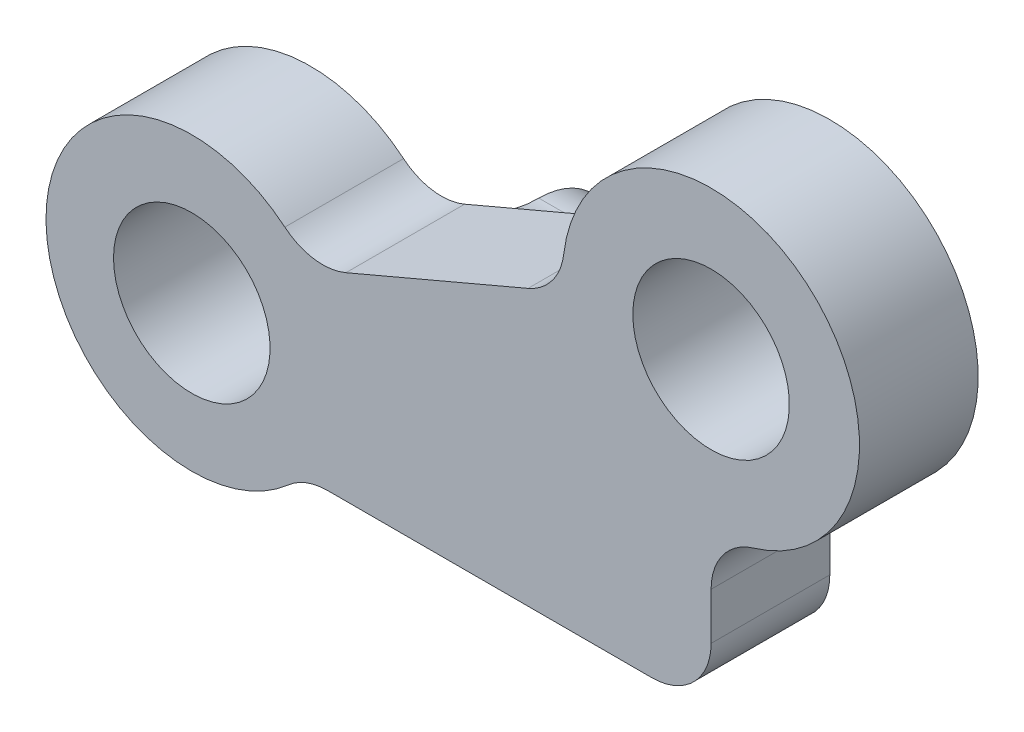
ISO-10303-21;
HEADER;
FILE_DESCRIPTION(('STEP AP214'),'2;1');
FILE_NAME('part.step','',(''),(''),'','','');
FILE_SCHEMA(('AUTOMOTIVE_DESIGN { 1 0 10303 214 1 1 1 1 }'));
ENDSEC;
DATA;
#1=APPLICATION_CONTEXT('core data for automotive mechanical design processes');
#2=APPLICATION_PROTOCOL_DEFINITION('international standard','automotive_design',2000,#1);
#3=PRODUCT_CONTEXT('',#1,'mechanical');
#4=PRODUCT('Part','Part','',(#3));
#5=PRODUCT_RELATED_PRODUCT_CATEGORY('part','',(#4));
#6=PRODUCT_DEFINITION_FORMATION('','',#4);
#7=PRODUCT_DEFINITION_CONTEXT('part definition',#1,'design');
#8=PRODUCT_DEFINITION('design','',#6,#7);
#9=PRODUCT_DEFINITION_SHAPE('','',#8);
#10=(LENGTH_UNIT() NAMED_UNIT(*) SI_UNIT(.MILLI.,.METRE.));
#11=(NAMED_UNIT(*) PLANE_ANGLE_UNIT() SI_UNIT($,.RADIAN.));
#12=(NAMED_UNIT(*) SI_UNIT($,.STERADIAN.) SOLID_ANGLE_UNIT());
#13=UNCERTAINTY_MEASURE_WITH_UNIT(LENGTH_MEASURE(1.E-05),#10,'distance_accuracy_value','');
#14=(GEOMETRIC_REPRESENTATION_CONTEXT(3) GLOBAL_UNCERTAINTY_ASSIGNED_CONTEXT((#13)) GLOBAL_UNIT_ASSIGNED_CONTEXT((#10,
#11,#12)) REPRESENTATION_CONTEXT('',''));
#15=CARTESIAN_POINT('',(0.,0.,0.));
#16=DIRECTION('',(0.,0.,1.));
#17=DIRECTION('',(1.,0.,0.));
#18=AXIS2_PLACEMENT_3D('',#15,#16,#17);
#19=CARTESIAN_POINT('',(39.3405929872107,26.4759472363339,4.));
#20=DIRECTION('',(0.,0.,-1.));
#21=DIRECTION('',(-1.,0.,0.));
#22=AXIS2_PLACEMENT_3D('',#19,#20,#21);
#23=CYLINDRICAL_SURFACE('',#22,4.91303849973908);
#24=CARTESIAN_POINT('',(39.3405929872107,26.4759472363339,0.));
#25=DIRECTION('',(0.,0.,-1.));
#26=DIRECTION('',(-1.,0.,0.));
#27=AXIS2_PLACEMENT_3D('',#24,#25,#26);
#28=CIRCLE('',#27,4.91303849973908);
#29=CARTESIAN_POINT('',(42.5911839602965,22.7919812178138,0.));
#30=VERTEX_POINT('',#29);
#31=CARTESIAN_POINT('',(42.4759512366879,30.2584696681713,0.));
#32=VERTEX_POINT('',#31);
#33=EDGE_CURVE('E199',#30,#32,#28,.T.);
#34=ORIENTED_EDGE('',*,*,#33,.F.);
#35=DIRECTION('',(0.,0.,-1.));
#36=VECTOR('',#35,1.);
#37=CARTESIAN_POINT('',(42.5911839602965,22.7919812178138,4.));
#38=LINE('',#37,#36);
#39=CARTESIAN_POINT('',(42.5911839602965,22.7919812178138,4.));
#40=VERTEX_POINT('',#39);
#41=EDGE_CURVE('E248',#30,#40,#38,.F.);
#42=ORIENTED_EDGE('',*,*,#41,.T.);
#43=CARTESIAN_POINT('',(39.3405929872107,26.4759472363339,4.));
#44=DIRECTION('',(0.,0.,-1.));
#45=DIRECTION('',(-1.,0.,0.));
#46=AXIS2_PLACEMENT_3D('',#43,#44,#45);
#47=CIRCLE('',#46,4.91303849973908);
#48=CARTESIAN_POINT('',(42.4759512366879,30.2584696681713,4.));
#49=VERTEX_POINT('',#48);
#50=EDGE_CURVE('E200',#40,#49,#47,.T.);
#51=ORIENTED_EDGE('',*,*,#50,.T.);
#52=DIRECTION('',(0.,0.,-1.));
#53=VECTOR('',#52,1.);
#54=CARTESIAN_POINT('',(42.4759512366879,30.2584696681713,4.));
#55=LINE('',#54,#53);
#56=EDGE_CURVE('E245',#49,#32,#55,.T.);
#57=ORIENTED_EDGE('',*,*,#56,.T.);
#58=EDGE_LOOP('',(#34,#42,#51,#57));
#59=FACE_BOUND('',#58,.T.);
#60=ADVANCED_FACE('F33',(#59),#23,.T.);
#61=CARTESIAN_POINT('',(56.8390710383438,23.2923121153975,4.));
#62=DIRECTION('',(0.,-1.,0.));
#63=DIRECTION('',(0.,0.,-1.));
#64=AXIS2_PLACEMENT_3D('',#61,#62,#63);
#65=PLANE('',#64);
#66=DIRECTION('',(-1.,0.,0.));
#67=VECTOR('',#66,1.);
#68=CARTESIAN_POINT('',(56.8390710383438,23.2923121153975,4.));
#69=LINE('',#68,#67);
#70=CARTESIAN_POINT('',(54.8390710383438,23.2923121153975,4.));
#71=VERTEX_POINT('',#70);
#72=CARTESIAN_POINT('',(43.9144347238549,23.2923121153975,4.));
#73=VERTEX_POINT('',#72);
#74=EDGE_CURVE('E213',#71,#73,#69,.T.);
#75=ORIENTED_EDGE('',*,*,#74,.T.);
#76=DIRECTION('',(0.,0.,1.));
#77=VECTOR('',#76,1.);
#78=CARTESIAN_POINT('',(43.9144347238549,23.2923121153975,0.));
#79=LINE('',#78,#77);
#80=CARTESIAN_POINT('',(43.9144347238549,23.2923121153975,0.));
#81=VERTEX_POINT('',#80);
#82=EDGE_CURVE('E242',#73,#81,#79,.F.);
#83=ORIENTED_EDGE('',*,*,#82,.T.);
#84=DIRECTION('',(-1.,0.,0.));
#85=VECTOR('',#84,1.);
#86=CARTESIAN_POINT('',(56.8390710383438,23.2923121153975,0.));
#87=LINE('',#86,#85);
#88=CARTESIAN_POINT('',(45.,23.2923121153975,0.));
#89=VERTEX_POINT('',#88);
#90=EDGE_CURVE('E228',#89,#81,#87,.T.);
#91=ORIENTED_EDGE('',*,*,#90,.F.);
#92=DIRECTION('',(1.,0.,0.));
#93=VECTOR('',#92,1.);
#94=CARTESIAN_POINT('',(36.7838954531117,23.2923121153975,0.));
#95=LINE('',#94,#93);
#96=CARTESIAN_POINT('',(47.,23.2923121153975,0.));
#97=VERTEX_POINT('',#96);
#98=EDGE_CURVE('E178',#89,#97,#95,.T.);
#99=ORIENTED_EDGE('',*,*,#98,.T.);
#100=CARTESIAN_POINT('',(54.8390710383438,23.2923121153975,0.));
#101=VERTEX_POINT('',#100);
#102=EDGE_CURVE('E204',#101,#97,#87,.T.);
#103=ORIENTED_EDGE('',*,*,#102,.F.);
#104=DIRECTION('',(0.,0.,-1.));
#105=VECTOR('',#104,1.);
#106=CARTESIAN_POINT('',(54.8390710383438,23.2923121153975,4.));
#107=LINE('',#106,#105);
#108=EDGE_CURVE('E240',#101,#71,#107,.F.);
#109=ORIENTED_EDGE('',*,*,#108,.T.);
#110=EDGE_LOOP('',(#75,#83,#91,#99,#103,#109));
#111=FACE_BOUND('',#110,.T.);
#112=ADVANCED_FACE('F313',(#111),#65,.T.);
#113=CARTESIAN_POINT('',(56.8390710383438,28.5799198029011,4.));
#114=DIRECTION('',(1.,0.,0.));
#115=DIRECTION('',(0.,0.,-1.));
#116=AXIS2_PLACEMENT_3D('',#113,#114,#115);
#117=PLANE('',#116);
#118=DIRECTION('',(0.,-1.,0.));
#119=VECTOR('',#118,1.);
#120=CARTESIAN_POINT('',(56.8390710383438,28.5799198029011,4.));
#121=LINE('',#120,#119);
#122=CARTESIAN_POINT('',(56.8390710383438,26.8717158704018,4.));
#123=VERTEX_POINT('',#122);
#124=CARTESIAN_POINT('',(56.8390710383438,25.2923121153975,4.));
#125=VERTEX_POINT('',#124);
#126=EDGE_CURVE('E210',#123,#125,#121,.T.);
#127=ORIENTED_EDGE('',*,*,#126,.T.);
#128=DIRECTION('',(0.,0.,-1.));
#129=VECTOR('',#128,1.);
#130=CARTESIAN_POINT('',(56.8390710383438,25.2923121153975,4.));
#131=LINE('',#130,#129);
#132=CARTESIAN_POINT('',(56.8390710383438,25.2923121153975,0.));
#133=VERTEX_POINT('',#132);
#134=EDGE_CURVE('E252',#125,#133,#131,.T.);
#135=ORIENTED_EDGE('',*,*,#134,.T.);
#136=DIRECTION('',(0.,-1.,0.));
#137=VECTOR('',#136,1.);
#138=CARTESIAN_POINT('',(56.8390710383438,28.5799198029011,0.));
#139=LINE('',#138,#137);
#140=CARTESIAN_POINT('',(56.8390710383438,26.8717158704018,0.));
#141=VERTEX_POINT('',#140);
#142=EDGE_CURVE('E225',#141,#133,#139,.T.);
#143=ORIENTED_EDGE('',*,*,#142,.F.);
#144=DIRECTION('',(0.,0.,1.));
#145=VECTOR('',#144,1.);
#146=CARTESIAN_POINT('',(56.8390710383438,26.8717158704018,4.));
#147=LINE('',#146,#145);
#148=EDGE_CURVE('E250',#141,#123,#147,.T.);
#149=ORIENTED_EDGE('',*,*,#148,.T.);
#150=EDGE_LOOP('',(#127,#135,#143,#149));
#151=FACE_BOUND('',#150,.T.);
#152=ADVANCED_FACE('F278',(#151),#117,.T.);
#153=CARTESIAN_POINT('',(56.8390710383438,33.5799198029011,4.));
#154=DIRECTION('',(0.,0.,-1.));
#155=DIRECTION('',(-1.,0.,0.));
#156=AXIS2_PLACEMENT_3D('',#153,#154,#155);
#157=CYLINDRICAL_SURFACE('',#156,5.);
#158=CARTESIAN_POINT('',(56.8390710383438,33.5799198029011,0.));
#159=DIRECTION('',(0.,0.,-1.));
#160=DIRECTION('',(-1.,0.,0.));
#161=AXIS2_PLACEMENT_3D('',#158,#159,#160);
#162=CIRCLE('',#161,5.);
#163=CARTESIAN_POINT('',(51.8742444876987,34.171947945821,0.));
#164=VERTEX_POINT('',#163);
#165=CARTESIAN_POINT('',(58.2676424669152,28.7883455654016,0.));
#166=VERTEX_POINT('',#165);
#167=EDGE_CURVE('E222',#164,#166,#162,.T.);
#168=ORIENTED_EDGE('',*,*,#167,.F.);
#169=DIRECTION('',(0.,0.,-1.));
#170=VECTOR('',#169,1.);
#171=CARTESIAN_POINT('',(51.8742444876987,34.171947945821,4.));
#172=LINE('',#171,#170);
#173=CARTESIAN_POINT('',(51.8742444876987,34.171947945821,4.));
#174=VERTEX_POINT('',#173);
#175=EDGE_CURVE('E238',#164,#174,#172,.F.);
#176=ORIENTED_EDGE('',*,*,#175,.T.);
#177=CARTESIAN_POINT('',(56.8390710383438,33.5799198029011,4.));
#178=DIRECTION('',(0.,0.,-1.));
#179=DIRECTION('',(-1.,0.,0.));
#180=AXIS2_PLACEMENT_3D('',#177,#178,#179);
#181=CIRCLE('',#180,5.);
#182=CARTESIAN_POINT('',(58.2676424669152,28.7883455654016,4.));
#183=VERTEX_POINT('',#182);
#184=EDGE_CURVE('E207',#174,#183,#181,.T.);
#185=ORIENTED_EDGE('',*,*,#184,.T.);
#186=DIRECTION('',(0.,0.,-1.));
#187=VECTOR('',#186,1.);
#188=CARTESIAN_POINT('',(58.2676424669152,28.7883455654016,4.));
#189=LINE('',#188,#187);
#190=EDGE_CURVE('E235',#183,#166,#189,.T.);
#191=ORIENTED_EDGE('',*,*,#190,.T.);
#192=EDGE_LOOP('',(#168,#176,#185,#191));
#193=FACE_BOUND('',#192,.T.);
#194=ADVANCED_FACE('F288',(#193),#157,.T.);
#195=CARTESIAN_POINT('',(43.2731470006214,29.4209372586473,4.));
#196=DIRECTION('',(-0.39148245786292,0.920185571059233,0.));
#197=DIRECTION('',(-0.920185571059233,-0.39148245786292,0.));
#198=AXIS2_PLACEMENT_3D('',#195,#196,#197);
#199=PLANE('',#198);
#200=DIRECTION('',(0.920185571059233,0.39148245786292,0.));
#201=VECTOR('',#200,1.);
#202=CARTESIAN_POINT('',(43.2731470006214,29.4209372586473,4.));
#203=LINE('',#202,#201);
#204=CARTESIAN_POINT('',(44.5352579721019,29.9578879789702,4.));
#205=VERTEX_POINT('',#204);
#206=CARTESIAN_POINT('',(50.6712787831665,32.5683880608705,4.));
#207=VERTEX_POINT('',#206);
#208=EDGE_CURVE('E203',#205,#207,#203,.T.);
#209=ORIENTED_EDGE('',*,*,#208,.T.);
#210=DIRECTION('',(0.,0.,1.));
#211=VECTOR('',#210,1.);
#212=CARTESIAN_POINT('',(50.6712787831665,32.5683880608705,0.));
#213=LINE('',#212,#211);
#214=CARTESIAN_POINT('',(50.6712787831665,32.5683880608705,0.));
#215=VERTEX_POINT('',#214);
#216=EDGE_CURVE('E232',#207,#215,#213,.F.);
#217=ORIENTED_EDGE('',*,*,#216,.T.);
#218=DIRECTION('',(0.920185571059233,0.39148245786292,0.));
#219=VECTOR('',#218,1.);
#220=CARTESIAN_POINT('',(43.2731470006214,29.4209372586473,0.));
#221=LINE('',#220,#219);
#222=CARTESIAN_POINT('',(44.5352579721019,29.9578879789702,0.));
#223=VERTEX_POINT('',#222);
#224=EDGE_CURVE('E219',#223,#215,#221,.T.);
#225=ORIENTED_EDGE('',*,*,#224,.F.);
#226=DIRECTION('',(0.,0.,1.));
#227=VECTOR('',#226,1.);
#228=CARTESIAN_POINT('',(44.5352579721019,29.9578879789702,4.));
#229=LINE('',#228,#227);
#230=EDGE_CURVE('E216',#223,#205,#229,.T.);
#231=ORIENTED_EDGE('',*,*,#230,.T.);
#232=EDGE_LOOP('',(#209,#217,#225,#231));
#233=FACE_BOUND('',#232,.T.);
#234=ADVANCED_FACE('F296',(#233),#199,.T.);
#235=CARTESIAN_POINT('',(39.3405929872107,26.4759472363339,4.));
#236=DIRECTION('',(0.,0.,-1.));
#237=DIRECTION('',(-1.,0.,0.));
#238=AXIS2_PLACEMENT_3D('',#235,#236,#237);
#239=PLANE('',#238);
#240=CARTESIAN_POINT('',(39.3405929872107,26.4759472363339,4.));
#241=DIRECTION('',(0.,0.,-1.));
#242=DIRECTION('',(-1.,0.,0.));
#243=AXIS2_PLACEMENT_3D('',#240,#241,#242);
#244=CIRCLE('',#243,2.63750000000001);
#245=CARTESIAN_POINT('',(36.7030929872106,26.4759472363339,4.));
#246=VERTEX_POINT('',#245);
#247=EDGE_CURVE('E190',#246,#246,#244,.T.);
#248=ORIENTED_EDGE('',*,*,#247,.T.);
#249=EDGE_LOOP('',(#248));
#250=FACE_BOUND('',#249,.T.);
#251=CARTESIAN_POINT('',(56.8390710383438,33.5799198029011,4.));
#252=DIRECTION('',(0.,0.,-1.));
#253=DIRECTION('',(-1.,0.,0.));
#254=AXIS2_PLACEMENT_3D('',#251,#252,#253);
#255=CIRCLE('',#254,2.63750000000001);
#256=CARTESIAN_POINT('',(54.2015710383438,33.5799198029011,4.));
#257=VERTEX_POINT('',#256);
#258=EDGE_CURVE('E196',#257,#257,#255,.T.);
#259=ORIENTED_EDGE('',*,*,#258,.T.);
#260=EDGE_LOOP('',(#259));
#261=FACE_BOUND('',#260,.T.);
#262=ORIENTED_EDGE('',*,*,#74,.F.);
#263=CARTESIAN_POINT('',(54.8390710383438,25.2923121153975,4.));
#264=DIRECTION('',(0.,0.,-1.));
#265=DIRECTION('',(-1.,0.,0.));
#266=AXIS2_PLACEMENT_3D('',#263,#264,#265);
#267=CIRCLE('',#266,2.);
#268=EDGE_CURVE('E257',#71,#125,#267,.F.);
#269=ORIENTED_EDGE('',*,*,#268,.T.);
#270=ORIENTED_EDGE('',*,*,#126,.F.);
#271=CARTESIAN_POINT('',(58.8390710383438,26.8717158704018,4.));
#272=DIRECTION('',(0.,0.,-1.));
#273=DIRECTION('',(-1.,0.,0.));
#274=AXIS2_PLACEMENT_3D('',#271,#272,#273);
#275=CIRCLE('',#274,2.);
#276=EDGE_CURVE('E11',#123,#183,#275,.T.);
#277=ORIENTED_EDGE('',*,*,#276,.T.);
#278=ORIENTED_EDGE('',*,*,#184,.F.);
#279=CARTESIAN_POINT('',(49.8883138674406,34.4087592029889,4.));
#280=DIRECTION('',(0.,0.,-1.));
#281=DIRECTION('',(-1.,0.,0.));
#282=AXIS2_PLACEMENT_3D('',#279,#280,#281);
#283=CIRCLE('',#282,2.);
#284=EDGE_CURVE('E261',#174,#207,#283,.T.);
#285=ORIENTED_EDGE('',*,*,#284,.T.);
#286=ORIENTED_EDGE('',*,*,#208,.F.);
#287=CARTESIAN_POINT('',(43.752293056376,31.7982591210886,4.));
#288=DIRECTION('',(0.,0.,-1.));
#289=DIRECTION('',(-1.,0.,0.));
#290=AXIS2_PLACEMENT_3D('',#287,#288,#289);
#291=CIRCLE('',#290,2.);
#292=EDGE_CURVE('E269',#205,#49,#291,.T.);
#293=ORIENTED_EDGE('',*,*,#292,.T.);
#294=ORIENTED_EDGE('',*,*,#50,.F.);
#295=CARTESIAN_POINT('',(43.9144347238549,21.2923121153975,4.));
#296=DIRECTION('',(0.,0.,-1.));
#297=DIRECTION('',(-1.,0.,0.));
#298=AXIS2_PLACEMENT_3D('',#295,#296,#297);
#299=CIRCLE('',#298,2.);
#300=EDGE_CURVE('E265',#40,#73,#299,.T.);
#301=ORIENTED_EDGE('',*,*,#300,.T.);
#302=EDGE_LOOP('',(#262,#269,#270,#277,#278,#285,#286,#293,#294,#301));
#303=FACE_BOUND('',#302,.T.);
#304=ADVANCED_FACE('F285',(#250,#261,#303),#239,.F.);
#305=CARTESIAN_POINT('',(39.3405929872107,26.4759472363339,0.));
#306=DIRECTION('',(0.,0.,-1.));
#307=DIRECTION('',(-1.,0.,0.));
#308=AXIS2_PLACEMENT_3D('',#305,#306,#307);
#309=PLANE('',#308);
#310=DIRECTION('',(0.,1.,0.));
#311=VECTOR('',#310,1.);
#312=CARTESIAN_POINT('',(45.,23.2923121153975,0.));
#313=LINE('',#312,#311);
#314=CARTESIAN_POINT('',(45.,30.1441050305794,0.));
#315=VERTEX_POINT('',#314);
#316=EDGE_CURVE('E52',#89,#315,#313,.T.);
#317=ORIENTED_EDGE('',*,*,#316,.F.);
#318=ORIENTED_EDGE('',*,*,#90,.T.);
#319=CARTESIAN_POINT('',(43.9144347238549,21.2923121153975,0.));
#320=DIRECTION('',(0.,0.,-1.));
#321=DIRECTION('',(-1.,0.,0.));
#322=AXIS2_PLACEMENT_3D('',#319,#320,#321);
#323=CIRCLE('',#322,2.);
#324=EDGE_CURVE('E263',#81,#30,#323,.F.);
#325=ORIENTED_EDGE('',*,*,#324,.T.);
#326=ORIENTED_EDGE('',*,*,#33,.T.);
#327=CARTESIAN_POINT('',(43.752293056376,31.7982591210886,0.));
#328=DIRECTION('',(0.,0.,-1.));
#329=DIRECTION('',(-1.,0.,0.));
#330=AXIS2_PLACEMENT_3D('',#327,#328,#329);
#331=CIRCLE('',#330,2.);
#332=EDGE_CURVE('E267',#32,#223,#331,.F.);
#333=ORIENTED_EDGE('',*,*,#332,.T.);
#334=ORIENTED_EDGE('',*,*,#224,.T.);
#335=CARTESIAN_POINT('',(49.8883138674406,34.4087592029889,0.));
#336=DIRECTION('',(0.,0.,-1.));
#337=DIRECTION('',(-1.,0.,0.));
#338=AXIS2_PLACEMENT_3D('',#335,#336,#337);
#339=CIRCLE('',#338,2.);
#340=EDGE_CURVE('E259',#215,#164,#339,.F.);
#341=ORIENTED_EDGE('',*,*,#340,.T.);
#342=ORIENTED_EDGE('',*,*,#167,.T.);
#343=CARTESIAN_POINT('',(58.8390710383438,26.8717158704018,0.));
#344=DIRECTION('',(0.,0.,-1.));
#345=DIRECTION('',(-1.,0.,0.));
#346=AXIS2_PLACEMENT_3D('',#343,#344,#345);
#347=CIRCLE('',#346,2.);
#348=EDGE_CURVE('E41',#166,#141,#347,.F.);
#349=ORIENTED_EDGE('',*,*,#348,.T.);
#350=ORIENTED_EDGE('',*,*,#142,.T.);
#351=CARTESIAN_POINT('',(54.8390710383438,25.2923121153975,0.));
#352=DIRECTION('',(0.,0.,-1.));
#353=DIRECTION('',(-1.,0.,0.));
#354=AXIS2_PLACEMENT_3D('',#351,#352,#353);
#355=CIRCLE('',#354,2.);
#356=EDGE_CURVE('E255',#133,#101,#355,.T.);
#357=ORIENTED_EDGE('',*,*,#356,.T.);
#358=ORIENTED_EDGE('',*,*,#102,.T.);
#359=DIRECTION('',(0.,-1.,0.));
#360=VECTOR('',#359,1.);
#361=CARTESIAN_POINT('',(47.,23.2923121153975,0.));
#362=LINE('',#361,#360);
#363=CARTESIAN_POINT('',(47.,30.1441050305794,0.));
#364=VERTEX_POINT('',#363);
#365=EDGE_CURVE('E144',#364,#97,#362,.T.);
#366=ORIENTED_EDGE('',*,*,#365,.F.);
#367=DIRECTION('',(1.,0.,0.));
#368=VECTOR('',#367,1.);
#369=CARTESIAN_POINT('',(36.7838954531117,30.1441050305794,0.));
#370=LINE('',#369,#368);
#371=EDGE_CURVE('E48',#315,#364,#370,.T.);
#372=ORIENTED_EDGE('',*,*,#371,.F.);
#373=EDGE_LOOP('',(#317,#318,#325,#326,#333,#334,#341,#342,#349,#350,#357,#358,#366,#372));
#374=FACE_BOUND('',#373,.T.);
#375=CARTESIAN_POINT('',(39.3405929872107,26.4759472363339,0.));
#376=DIRECTION('',(0.,0.,-1.));
#377=DIRECTION('',(-1.,0.,0.));
#378=AXIS2_PLACEMENT_3D('',#375,#376,#377);
#379=CIRCLE('',#378,2.63750000000001);
#380=CARTESIAN_POINT('',(36.7030929872106,26.4759472363339,0.));
#381=VERTEX_POINT('',#380);
#382=EDGE_CURVE('E186',#381,#381,#379,.T.);
#383=ORIENTED_EDGE('',*,*,#382,.F.);
#384=EDGE_LOOP('',(#383));
#385=FACE_BOUND('',#384,.T.);
#386=CARTESIAN_POINT('',(56.8390710383438,33.5799198029011,0.));
#387=DIRECTION('',(0.,0.,-1.));
#388=DIRECTION('',(-1.,0.,0.));
#389=AXIS2_PLACEMENT_3D('',#386,#387,#388);
#390=CIRCLE('',#389,2.63750000000001);
#391=CARTESIAN_POINT('',(54.2015710383438,33.5799198029011,0.));
#392=VERTEX_POINT('',#391);
#393=EDGE_CURVE('E193',#392,#392,#390,.T.);
#394=ORIENTED_EDGE('',*,*,#393,.F.);
#395=EDGE_LOOP('',(#394));
#396=FACE_BOUND('',#395,.T.);
#397=ADVANCED_FACE('F271',(#374,#385,#396),#309,.T.);
#398=CARTESIAN_POINT('',(56.8390710383438,33.5799198029011,0.));
#399=DIRECTION('',(0.,0.,-1.));
#400=DIRECTION('',(-1.,0.,0.));
#401=AXIS2_PLACEMENT_3D('',#398,#399,#400);
#402=CYLINDRICAL_SURFACE('',#401,2.63750000000001);
#403=ORIENTED_EDGE('',*,*,#258,.F.);
#404=EDGE_LOOP('',(#403));
#405=FACE_BOUND('',#404,.T.);
#406=ORIENTED_EDGE('',*,*,#393,.T.);
#407=EDGE_LOOP('',(#406));
#408=FACE_BOUND('',#407,.T.);
#409=ADVANCED_FACE('F350',(#405,#408),#402,.F.);
#410=CARTESIAN_POINT('',(39.3405929872107,26.4759472363339,0.));
#411=DIRECTION('',(0.,0.,-1.));
#412=DIRECTION('',(-1.,0.,0.));
#413=AXIS2_PLACEMENT_3D('',#410,#411,#412);
#414=CYLINDRICAL_SURFACE('',#413,2.63750000000001);
#415=ORIENTED_EDGE('',*,*,#247,.F.);
#416=EDGE_LOOP('',(#415));
#417=FACE_BOUND('',#416,.T.);
#418=ORIENTED_EDGE('',*,*,#382,.T.);
#419=EDGE_LOOP('',(#418));
#420=FACE_BOUND('',#419,.T.);
#421=ADVANCED_FACE('F347',(#417,#420),#414,.F.);
#422=CARTESIAN_POINT('',(49.8883138674406,34.4087592029889,4.));
#423=DIRECTION('',(0.,0.,-1.));
#424=DIRECTION('',(-1.,0.,0.));
#425=AXIS2_PLACEMENT_3D('',#422,#423,#424);
#426=CYLINDRICAL_SURFACE('',#425,2.);
#427=ORIENTED_EDGE('',*,*,#284,.F.);
#428=ORIENTED_EDGE('',*,*,#175,.F.);
#429=ORIENTED_EDGE('',*,*,#340,.F.);
#430=ORIENTED_EDGE('',*,*,#216,.F.);
#431=EDGE_LOOP('',(#427,#428,#429,#430));
#432=FACE_BOUND('',#431,.T.);
#433=ADVANCED_FACE('F291',(#432),#426,.F.);
#434=CARTESIAN_POINT('',(43.9144347238549,21.2923121153975,4.));
#435=DIRECTION('',(0.,0.,-1.));
#436=DIRECTION('',(-1.,0.,0.));
#437=AXIS2_PLACEMENT_3D('',#434,#435,#436);
#438=CYLINDRICAL_SURFACE('',#437,2.);
#439=ORIENTED_EDGE('',*,*,#300,.F.);
#440=ORIENTED_EDGE('',*,*,#41,.F.);
#441=ORIENTED_EDGE('',*,*,#324,.F.);
#442=ORIENTED_EDGE('',*,*,#82,.F.);
#443=EDGE_LOOP('',(#439,#440,#441,#442));
#444=FACE_BOUND('',#443,.T.);
#445=ADVANCED_FACE('F309',(#444),#438,.F.);
#446=CARTESIAN_POINT('',(43.752293056376,31.7982591210886,4.));
#447=DIRECTION('',(0.,0.,-1.));
#448=DIRECTION('',(-1.,0.,0.));
#449=AXIS2_PLACEMENT_3D('',#446,#447,#448);
#450=CYLINDRICAL_SURFACE('',#449,2.);
#451=ORIENTED_EDGE('',*,*,#292,.F.);
#452=ORIENTED_EDGE('',*,*,#230,.F.);
#453=ORIENTED_EDGE('',*,*,#332,.F.);
#454=ORIENTED_EDGE('',*,*,#56,.F.);
#455=EDGE_LOOP('',(#451,#452,#453,#454));
#456=FACE_BOUND('',#455,.T.);
#457=ADVANCED_FACE('F300',(#456),#450,.F.);
#458=CARTESIAN_POINT('',(54.8390710383438,25.2923121153975,4.));
#459=DIRECTION('',(0.,0.,-1.));
#460=DIRECTION('',(-1.,0.,0.));
#461=AXIS2_PLACEMENT_3D('',#458,#459,#460);
#462=CYLINDRICAL_SURFACE('',#461,2.);
#463=ORIENTED_EDGE('',*,*,#268,.F.);
#464=ORIENTED_EDGE('',*,*,#108,.F.);
#465=ORIENTED_EDGE('',*,*,#356,.F.);
#466=ORIENTED_EDGE('',*,*,#134,.F.);
#467=EDGE_LOOP('',(#463,#464,#465,#466));
#468=FACE_BOUND('',#467,.T.);
#469=ADVANCED_FACE('F317',(#468),#462,.T.);
#470=CARTESIAN_POINT('',(58.8390710383438,26.8717158704018,4.));
#471=DIRECTION('',(0.,0.,-1.));
#472=DIRECTION('',(-1.,0.,0.));
#473=AXIS2_PLACEMENT_3D('',#470,#471,#472);
#474=CYLINDRICAL_SURFACE('',#473,2.);
#475=ORIENTED_EDGE('',*,*,#276,.F.);
#476=ORIENTED_EDGE('',*,*,#148,.F.);
#477=ORIENTED_EDGE('',*,*,#348,.F.);
#478=ORIENTED_EDGE('',*,*,#190,.F.);
#479=EDGE_LOOP('',(#475,#476,#477,#478));
#480=FACE_BOUND('',#479,.T.);
#481=ADVANCED_FACE('F35',(#480),#474,.F.);
#482=CARTESIAN_POINT('',(36.7838954531117,26.8495531149059,-2.03401673716158));
#483=DIRECTION('',(1.,0.,0.));
#484=DIRECTION('',(0.,0.,-1.));
#485=AXIS2_PLACEMENT_3D('',#482,#483,#484);
#486=CYLINDRICAL_SURFACE('',#485,2.5);
#487=CARTESIAN_POINT('',(45.,26.8495531149059,-2.03401673716158));
#488=DIRECTION('',(1.,0.,0.));
#489=DIRECTION('',(0.,0.,-1.));
#490=AXIS2_PLACEMENT_3D('',#487,#488,#489);
#491=CIRCLE('',#490,2.5);
#492=CARTESIAN_POINT('',(45.,29.3495531149059,-2.03401673716158));
#493=VERTEX_POINT('',#492);
#494=CARTESIAN_POINT('',(45.,24.3495531149059,-2.03401673716158));
#495=VERTEX_POINT('',#494);
#496=EDGE_CURVE('E187',#493,#495,#491,.F.);
#497=ORIENTED_EDGE('',*,*,#496,.F.);
#498=DIRECTION('',(1.,0.,0.));
#499=VECTOR('',#498,1.);
#500=CARTESIAN_POINT('',(36.7838954531117,29.3495531149059,-2.03401673716158));
#501=LINE('',#500,#499);
#502=CARTESIAN_POINT('',(47.,29.3495531149059,-2.03401673716158));
#503=VERTEX_POINT('',#502);
#504=EDGE_CURVE('E143',#493,#503,#501,.T.);
#505=ORIENTED_EDGE('',*,*,#504,.T.);
#506=CARTESIAN_POINT('',(47.,26.8495531149059,-2.03401673716158));
#507=DIRECTION('',(1.,0.,0.));
#508=DIRECTION('',(0.,0.,-1.));
#509=AXIS2_PLACEMENT_3D('',#506,#507,#508);
#510=CIRCLE('',#509,2.5);
#511=CARTESIAN_POINT('',(47.,24.3495531149059,-2.03401673716158));
#512=VERTEX_POINT('',#511);
#513=EDGE_CURVE('E147',#512,#503,#510,.T.);
#514=ORIENTED_EDGE('',*,*,#513,.F.);
#515=DIRECTION('',(1.,0.,0.));
#516=VECTOR('',#515,1.);
#517=CARTESIAN_POINT('',(36.7838954531117,24.3495531149059,-2.03401673716158));
#518=LINE('',#517,#516);
#519=EDGE_CURVE('E132',#495,#512,#518,.T.);
#520=ORIENTED_EDGE('',*,*,#519,.F.);
#521=EDGE_LOOP('',(#497,#505,#514,#520));
#522=FACE_BOUND('',#521,.T.);
#523=ADVANCED_FACE('F148',(#522),#486,.T.);
#524=CARTESIAN_POINT('',(36.7838954531117,29.3495531149059,-2.03401673716158));
#525=CARTESIAN_POINT('',(36.7838954531117,29.3488282019513,-0.844292257301695));
#526=CARTESIAN_POINT('',(36.7838954531117,30.1441050305794,0.));
#527=B_SPLINE_CURVE_WITH_KNOTS('',2,(#524,#525,#526),.UNSPECIFIED.,.F.,.F.,(3,3),(0.,1.),.UNSPECIFIED.);
#528=DIRECTION('',(1.,0.,0.));
#529=VECTOR('',#528,1.);
#530=SURFACE_OF_LINEAR_EXTRUSION('',#527,#529);
#531=CARTESIAN_POINT('',(45.,29.3495531149059,-2.03401673716158));
#532=CARTESIAN_POINT('',(45.,29.3488282019513,-0.844292257301695));
#533=CARTESIAN_POINT('',(45.,30.1441050305794,0.));
#534=B_SPLINE_CURVE_WITH_KNOTS('',2,(#531,#532,#533),.UNSPECIFIED.,.F.,.F.,(3,3),(0.,1.),.UNSPECIFIED.);
#535=EDGE_CURVE('E180',#315,#493,#534,.F.);
#536=ORIENTED_EDGE('',*,*,#535,.F.);
#537=ORIENTED_EDGE('',*,*,#371,.T.);
#538=CARTESIAN_POINT('',(47.,29.3495531149059,-2.03401673716158));
#539=CARTESIAN_POINT('',(47.,29.3488282019513,-0.844292257301695));
#540=CARTESIAN_POINT('',(47.,30.1441050305794,0.));
#541=B_SPLINE_CURVE_WITH_KNOTS('',2,(#538,#539,#540),.UNSPECIFIED.,.F.,.F.,(3,3),(0.,1.),.UNSPECIFIED.);
#542=EDGE_CURVE('E153',#503,#364,#541,.T.);
#543=ORIENTED_EDGE('',*,*,#542,.F.);
#544=ORIENTED_EDGE('',*,*,#504,.F.);
#545=EDGE_LOOP('',(#536,#537,#543,#544));
#546=FACE_BOUND('',#545,.T.);
#547=ADVANCED_FACE('F320',(#546),#530,.T.);
#548=CARTESIAN_POINT('',(36.7838954531117,23.2923121153975,0.));
#549=CARTESIAN_POINT('',(36.7838954531117,24.3593633184378,-0.725821755532754));
#550=CARTESIAN_POINT('',(36.7838954531117,24.3495531149059,-2.03401673716158));
#551=B_SPLINE_CURVE_WITH_KNOTS('',2,(#548,#549,#550),.UNSPECIFIED.,.F.,.F.,(3,3),(0.,1.),.UNSPECIFIED.);
#552=DIRECTION('',(1.,0.,0.));
#553=VECTOR('',#552,1.);
#554=SURFACE_OF_LINEAR_EXTRUSION('',#551,#553);
#555=CARTESIAN_POINT('',(45.,23.2923121153975,0.));
#556=CARTESIAN_POINT('',(45.,24.3593633184378,-0.725821755532754));
#557=CARTESIAN_POINT('',(45.,24.3495531149059,-2.03401673716158));
#558=B_SPLINE_CURVE_WITH_KNOTS('',2,(#555,#556,#557),.UNSPECIFIED.,.F.,.F.,(3,3),(0.,1.),.UNSPECIFIED.);
#559=EDGE_CURVE('E140',#495,#89,#558,.F.);
#560=ORIENTED_EDGE('',*,*,#559,.F.);
#561=ORIENTED_EDGE('',*,*,#519,.T.);
#562=CARTESIAN_POINT('',(47.,23.2923121153975,0.));
#563=CARTESIAN_POINT('',(47.,24.3593633184378,-0.725821755532754));
#564=CARTESIAN_POINT('',(47.,24.3495531149059,-2.03401673716158));
#565=B_SPLINE_CURVE_WITH_KNOTS('',2,(#562,#563,#564),.UNSPECIFIED.,.F.,.F.,(3,3),(0.,1.),.UNSPECIFIED.);
#566=EDGE_CURVE('E137',#97,#512,#565,.T.);
#567=ORIENTED_EDGE('',*,*,#566,.F.);
#568=ORIENTED_EDGE('',*,*,#98,.F.);
#569=EDGE_LOOP('',(#560,#561,#567,#568));
#570=FACE_BOUND('',#569,.T.);
#571=ADVANCED_FACE('F134',(#570),#554,.T.);
#572=CARTESIAN_POINT('',(47.,24.0901479667947,-0.871415062056772));
#573=DIRECTION('',(-1.,0.,0.));
#574=DIRECTION('',(0.,0.,1.));
#575=AXIS2_PLACEMENT_3D('',#572,#573,#574);
#576=PLANE('',#575);
#577=CARTESIAN_POINT('',(47.,26.8495531149059,-2.03401673716158));
#578=DIRECTION('',(1.,0.,0.));
#579=DIRECTION('',(0.,0.,-1.));
#580=AXIS2_PLACEMENT_3D('',#577,#578,#579);
#581=CIRCLE('',#580,1.5065226661907);
#582=CARTESIAN_POINT('',(47.,26.8495531149059,-3.54053940335228));
#583=VERTEX_POINT('',#582);
#584=EDGE_CURVE('E156',#583,#583,#581,.T.);
#585=ORIENTED_EDGE('',*,*,#584,.F.);
#586=EDGE_LOOP('',(#585));
#587=FACE_BOUND('',#586,.T.);
#588=ORIENTED_EDGE('',*,*,#566,.T.);
#589=ORIENTED_EDGE('',*,*,#513,.T.);
#590=ORIENTED_EDGE('',*,*,#542,.T.);
#591=ORIENTED_EDGE('',*,*,#365,.T.);
#592=EDGE_LOOP('',(#588,#589,#590,#591));
#593=FACE_BOUND('',#592,.T.);
#594=ADVANCED_FACE('F155',(#587,#593),#576,.F.);
#595=CARTESIAN_POINT('',(36.7838954531117,26.8495531149059,-2.03401673716158));
#596=DIRECTION('',(1.,0.,0.));
#597=DIRECTION('',(0.,0.,-1.));
#598=AXIS2_PLACEMENT_3D('',#595,#596,#597);
#599=CYLINDRICAL_SURFACE('',#598,1.5065226661907);
#600=CARTESIAN_POINT('',(45.,26.8495531149059,-2.03401673716158));
#601=DIRECTION('',(1.,0.,0.));
#602=DIRECTION('',(0.,0.,-1.));
#603=AXIS2_PLACEMENT_3D('',#600,#601,#602);
#604=CIRCLE('',#603,1.5065226661907);
#605=CARTESIAN_POINT('',(45.,26.8495531149059,-3.54053940335228));
#606=VERTEX_POINT('',#605);
#607=EDGE_CURVE('E183',#606,#606,#604,.F.);
#608=ORIENTED_EDGE('',*,*,#607,.T.);
#609=EDGE_LOOP('',(#608));
#610=FACE_BOUND('',#609,.T.);
#611=ORIENTED_EDGE('',*,*,#584,.T.);
#612=EDGE_LOOP('',(#611));
#613=FACE_BOUND('',#612,.T.);
#614=ADVANCED_FACE('F390',(#610,#613),#599,.F.);
#615=CARTESIAN_POINT('',(45.,0.,0.));
#616=DIRECTION('',(1.,0.,0.));
#617=DIRECTION('',(0.,0.,-1.));
#618=AXIS2_PLACEMENT_3D('',#615,#616,#617);
#619=PLANE('',#618);
#620=ORIENTED_EDGE('',*,*,#559,.T.);
#621=ORIENTED_EDGE('',*,*,#316,.T.);
#622=ORIENTED_EDGE('',*,*,#535,.T.);
#623=ORIENTED_EDGE('',*,*,#496,.T.);
#624=EDGE_LOOP('',(#620,#621,#622,#623));
#625=FACE_BOUND('',#624,.T.);
#626=ORIENTED_EDGE('',*,*,#607,.F.);
#627=EDGE_LOOP('',(#626));
#628=FACE_BOUND('',#627,.T.);
#629=ADVANCED_FACE('F394',(#625,#628),#619,.F.);
#630=CLOSED_SHELL('',(#60,#112,#152,#194,#234,#304,#397,#409,#421,#433,#445,#457,#469,#481,#523,
#547,#571,#594,#614,#629));
#631=MANIFOLD_SOLID_BREP('B2',#630);
#632=ADVANCED_BREP_SHAPE_REPRESENTATION('',(#18,#631),#14);
#633=SHAPE_DEFINITION_REPRESENTATION(#9,#632);
ENDSEC;
END-ISO-10303-21;
